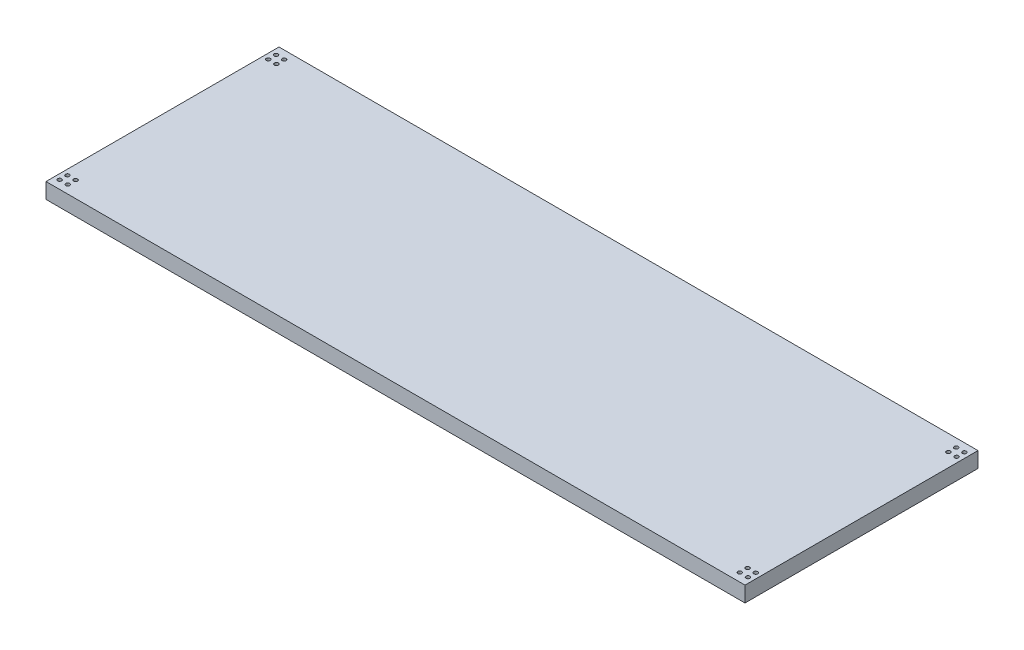
ISO-10303-21;
HEADER;
FILE_DESCRIPTION(('STEP AP214'),'2;1');
FILE_NAME('part.step','',(''),(''),'','','');
FILE_SCHEMA(('AUTOMOTIVE_DESIGN { 1 0 10303 214 1 1 1 1 }'));
ENDSEC;
DATA;
#1=APPLICATION_CONTEXT('core data for automotive mechanical design processes');
#2=APPLICATION_PROTOCOL_DEFINITION('international standard','automotive_design',2000,#1);
#3=PRODUCT_CONTEXT('',#1,'mechanical');
#4=PRODUCT('Part','Part','',(#3));
#5=PRODUCT_RELATED_PRODUCT_CATEGORY('part','',(#4));
#6=PRODUCT_DEFINITION_FORMATION('','',#4);
#7=PRODUCT_DEFINITION_CONTEXT('part definition',#1,'design');
#8=PRODUCT_DEFINITION('design','',#6,#7);
#9=PRODUCT_DEFINITION_SHAPE('','',#8);
#10=(LENGTH_UNIT() NAMED_UNIT(*) SI_UNIT(.MILLI.,.METRE.));
#11=(NAMED_UNIT(*) PLANE_ANGLE_UNIT() SI_UNIT($,.RADIAN.));
#12=(NAMED_UNIT(*) SI_UNIT($,.STERADIAN.) SOLID_ANGLE_UNIT());
#13=UNCERTAINTY_MEASURE_WITH_UNIT(LENGTH_MEASURE(1.E-05),#10,'distance_accuracy_value','');
#14=(GEOMETRIC_REPRESENTATION_CONTEXT(3) GLOBAL_UNCERTAINTY_ASSIGNED_CONTEXT((#13)) GLOBAL_UNIT_ASSIGNED_CONTEXT((#10,
#11,#12)) REPRESENTATION_CONTEXT('',''));
#15=CARTESIAN_POINT('',(0.,0.,0.));
#16=DIRECTION('',(0.,0.,1.));
#17=DIRECTION('',(1.,0.,0.));
#18=AXIS2_PLACEMENT_3D('',#15,#16,#17);
#19=CARTESIAN_POINT('',(0.,40.,0.));
#20=DIRECTION('',(0.,1.,0.));
#21=DIRECTION('',(0.,0.,1.));
#22=AXIS2_PLACEMENT_3D('',#19,#20,#21);
#23=PLANE('',#22);
#24=CARTESIAN_POINT('',(-865.244681743922,40.,-258.618032201995));
#25=DIRECTION('',(0.,1.,0.));
#26=DIRECTION('',(0.,0.,-1.));
#27=AXIS2_PLACEMENT_3D('',#24,#25,#26);
#28=CIRCLE('',#27,5.00000000000005);
#29=CARTESIAN_POINT('',(-865.244681743922,40.,-263.618032201995));
#30=VERTEX_POINT('',#29);
#31=EDGE_CURVE('E199',#30,#30,#28,.T.);
#32=ORIENTED_EDGE('',*,*,#31,.F.);
#33=EDGE_LOOP('',(#32));
#34=FACE_BOUND('',#33,.T.);
#35=CARTESIAN_POINT('',(-886.273197469976,40.,-278.618032201996));
#36=DIRECTION('',(0.,1.,0.));
#37=DIRECTION('',(0.,0.,-1.));
#38=AXIS2_PLACEMENT_3D('',#35,#36,#37);
#39=CIRCLE('',#38,5.00000000000005);
#40=CARTESIAN_POINT('',(-886.273197469976,40.,-283.618032201996));
#41=VERTEX_POINT('',#40);
#42=EDGE_CURVE('E187',#41,#41,#39,.T.);
#43=ORIENTED_EDGE('',*,*,#42,.F.);
#44=EDGE_LOOP('',(#43));
#45=FACE_BOUND('',#44,.T.);
#46=CARTESIAN_POINT('',(886.273197469975,40.,-258.618032201996));
#47=DIRECTION('',(0.,1.,0.));
#48=DIRECTION('',(0.,0.,1.));
#49=AXIS2_PLACEMENT_3D('',#46,#47,#48);
#50=CIRCLE('',#49,5.00000000000005);
#51=CARTESIAN_POINT('',(886.273197469975,40.,-253.618032201995));
#52=VERTEX_POINT('',#51);
#53=EDGE_CURVE('E175',#52,#52,#50,.T.);
#54=ORIENTED_EDGE('',*,*,#53,.F.);
#55=EDGE_LOOP('',(#54));
#56=FACE_BOUND('',#55,.T.);
#57=CARTESIAN_POINT('',(865.244681743922,40.,-278.618032201995));
#58=DIRECTION('',(0.,1.,0.));
#59=DIRECTION('',(0.,0.,1.));
#60=AXIS2_PLACEMENT_3D('',#57,#58,#59);
#61=CIRCLE('',#60,5.00000000000005);
#62=CARTESIAN_POINT('',(865.244681743922,40.,-273.618032201995));
#63=VERTEX_POINT('',#62);
#64=EDGE_CURVE('E163',#63,#63,#61,.T.);
#65=ORIENTED_EDGE('',*,*,#64,.F.);
#66=EDGE_LOOP('',(#65));
#67=FACE_BOUND('',#66,.T.);
#68=CARTESIAN_POINT('',(865.244681743922,40.,258.618032201995));
#69=DIRECTION('',(0.,1.,0.));
#70=DIRECTION('',(0.,0.,-1.));
#71=AXIS2_PLACEMENT_3D('',#68,#69,#70);
#72=CIRCLE('',#71,5.00000000000005);
#73=CARTESIAN_POINT('',(865.244681743922,40.,253.618032201995));
#74=VERTEX_POINT('',#73);
#75=EDGE_CURVE('E151',#74,#74,#72,.T.);
#76=ORIENTED_EDGE('',*,*,#75,.F.);
#77=EDGE_LOOP('',(#76));
#78=FACE_BOUND('',#77,.T.);
#79=CARTESIAN_POINT('',(886.273197469975,40.,278.618032201995));
#80=DIRECTION('',(0.,1.,0.));
#81=DIRECTION('',(0.,0.,-1.));
#82=AXIS2_PLACEMENT_3D('',#79,#80,#81);
#83=CIRCLE('',#82,5.00000000000005);
#84=CARTESIAN_POINT('',(886.273197469975,40.,273.618032201995));
#85=VERTEX_POINT('',#84);
#86=EDGE_CURVE('E139',#85,#85,#83,.T.);
#87=ORIENTED_EDGE('',*,*,#86,.F.);
#88=EDGE_LOOP('',(#87));
#89=FACE_BOUND('',#88,.T.);
#90=CARTESIAN_POINT('',(-865.244681743922,40.,258.618032201995));
#91=DIRECTION('',(0.,1.,0.));
#92=DIRECTION('',(0.,0.,1.));
#93=AXIS2_PLACEMENT_3D('',#90,#91,#92);
#94=CIRCLE('',#93,5.00000000000005);
#95=CARTESIAN_POINT('',(-865.244681743922,40.,263.618032201995));
#96=VERTEX_POINT('',#95);
#97=EDGE_CURVE('E127',#96,#96,#94,.T.);
#98=ORIENTED_EDGE('',*,*,#97,.F.);
#99=EDGE_LOOP('',(#98));
#100=FACE_BOUND('',#99,.T.);
#101=CARTESIAN_POINT('',(-886.273197469976,40.,278.618032201995));
#102=DIRECTION('',(0.,1.,0.));
#103=DIRECTION('',(0.,0.,1.));
#104=AXIS2_PLACEMENT_3D('',#101,#102,#103);
#105=CIRCLE('',#104,5.00000000000005);
#106=CARTESIAN_POINT('',(-886.273197469976,40.,283.618032201996));
#107=VERTEX_POINT('',#106);
#108=EDGE_CURVE('E106',#107,#107,#105,.T.);
#109=ORIENTED_EDGE('',*,*,#108,.F.);
#110=EDGE_LOOP('',(#109));
#111=FACE_BOUND('',#110,.T.);
#112=DIRECTION('',(0.,0.,-1.));
#113=VECTOR('',#112,1.);
#114=CARTESIAN_POINT('',(900.,40.,-300.));
#115=LINE('',#114,#113);
#116=CARTESIAN_POINT('',(900.,40.,300.));
#117=VERTEX_POINT('',#116);
#118=CARTESIAN_POINT('',(900.,40.,-300.));
#119=VERTEX_POINT('',#118);
#120=EDGE_CURVE('E91',#117,#119,#115,.T.);
#121=ORIENTED_EDGE('',*,*,#120,.T.);
#122=DIRECTION('',(-1.,0.,0.));
#123=VECTOR('',#122,1.);
#124=CARTESIAN_POINT('',(-900.,40.,-300.));
#125=LINE('',#124,#123);
#126=CARTESIAN_POINT('',(-900.,40.,-300.));
#127=VERTEX_POINT('',#126);
#128=EDGE_CURVE('E86',#119,#127,#125,.T.);
#129=ORIENTED_EDGE('',*,*,#128,.T.);
#130=DIRECTION('',(0.,0.,1.));
#131=VECTOR('',#130,1.);
#132=CARTESIAN_POINT('',(-900.,40.,-300.));
#133=LINE('',#132,#131);
#134=CARTESIAN_POINT('',(-900.,40.,300.));
#135=VERTEX_POINT('',#134);
#136=EDGE_CURVE('E89',#127,#135,#133,.T.);
#137=ORIENTED_EDGE('',*,*,#136,.T.);
#138=DIRECTION('',(1.,0.,0.));
#139=VECTOR('',#138,1.);
#140=CARTESIAN_POINT('',(-900.,40.,300.));
#141=LINE('',#140,#139);
#142=EDGE_CURVE('E56',#135,#117,#141,.T.);
#143=ORIENTED_EDGE('',*,*,#142,.T.);
#144=EDGE_LOOP('',(#121,#129,#137,#143));
#145=FACE_BOUND('',#144,.T.);
#146=CARTESIAN_POINT('',(-865.244681743922,40.,278.618032201995));
#147=DIRECTION('',(0.,1.,0.));
#148=DIRECTION('',(0.,0.,1.));
#149=AXIS2_PLACEMENT_3D('',#146,#147,#148);
#150=CIRCLE('',#149,5.00000000000005);
#151=CARTESIAN_POINT('',(-865.244681743922,40.,283.618032201995));
#152=VERTEX_POINT('',#151);
#153=EDGE_CURVE('E121',#152,#152,#150,.T.);
#154=ORIENTED_EDGE('',*,*,#153,.F.);
#155=EDGE_LOOP('',(#154));
#156=FACE_BOUND('',#155,.T.);
#157=CARTESIAN_POINT('',(-886.273197469976,40.,258.618032201995));
#158=DIRECTION('',(0.,1.,0.));
#159=DIRECTION('',(0.,0.,1.));
#160=AXIS2_PLACEMENT_3D('',#157,#158,#159);
#161=CIRCLE('',#160,5.00000000000005);
#162=CARTESIAN_POINT('',(-886.273197469976,40.,263.618032201996));
#163=VERTEX_POINT('',#162);
#164=EDGE_CURVE('E133',#163,#163,#161,.T.);
#165=ORIENTED_EDGE('',*,*,#164,.F.);
#166=EDGE_LOOP('',(#165));
#167=FACE_BOUND('',#166,.T.);
#168=CARTESIAN_POINT('',(886.273197469975,40.,258.618032201995));
#169=DIRECTION('',(0.,1.,0.));
#170=DIRECTION('',(0.,0.,-1.));
#171=AXIS2_PLACEMENT_3D('',#168,#169,#170);
#172=CIRCLE('',#171,5.00000000000005);
#173=CARTESIAN_POINT('',(886.273197469975,40.,253.618032201995));
#174=VERTEX_POINT('',#173);
#175=EDGE_CURVE('E145',#174,#174,#172,.T.);
#176=ORIENTED_EDGE('',*,*,#175,.F.);
#177=EDGE_LOOP('',(#176));
#178=FACE_BOUND('',#177,.T.);
#179=CARTESIAN_POINT('',(865.244681743922,40.,278.618032201995));
#180=DIRECTION('',(0.,1.,0.));
#181=DIRECTION('',(0.,0.,-1.));
#182=AXIS2_PLACEMENT_3D('',#179,#180,#181);
#183=CIRCLE('',#182,5.00000000000005);
#184=CARTESIAN_POINT('',(865.244681743922,40.,273.618032201995));
#185=VERTEX_POINT('',#184);
#186=EDGE_CURVE('E157',#185,#185,#183,.T.);
#187=ORIENTED_EDGE('',*,*,#186,.F.);
#188=EDGE_LOOP('',(#187));
#189=FACE_BOUND('',#188,.T.);
#190=CARTESIAN_POINT('',(886.273197469975,40.,-278.618032201996));
#191=DIRECTION('',(0.,1.,0.));
#192=DIRECTION('',(0.,0.,1.));
#193=AXIS2_PLACEMENT_3D('',#190,#191,#192);
#194=CIRCLE('',#193,5.00000000000005);
#195=CARTESIAN_POINT('',(886.273197469975,40.,-273.618032201996));
#196=VERTEX_POINT('',#195);
#197=EDGE_CURVE('E169',#196,#196,#194,.T.);
#198=ORIENTED_EDGE('',*,*,#197,.F.);
#199=EDGE_LOOP('',(#198));
#200=FACE_BOUND('',#199,.T.);
#201=CARTESIAN_POINT('',(865.244681743922,40.,-258.618032201995));
#202=DIRECTION('',(0.,1.,0.));
#203=DIRECTION('',(0.,0.,1.));
#204=AXIS2_PLACEMENT_3D('',#201,#202,#203);
#205=CIRCLE('',#204,5.00000000000005);
#206=CARTESIAN_POINT('',(865.244681743922,40.,-253.618032201995));
#207=VERTEX_POINT('',#206);
#208=EDGE_CURVE('E181',#207,#207,#205,.T.);
#209=ORIENTED_EDGE('',*,*,#208,.F.);
#210=EDGE_LOOP('',(#209));
#211=FACE_BOUND('',#210,.T.);
#212=CARTESIAN_POINT('',(-865.244681743922,40.,-278.618032201995));
#213=DIRECTION('',(0.,1.,0.));
#214=DIRECTION('',(0.,0.,-1.));
#215=AXIS2_PLACEMENT_3D('',#212,#213,#214);
#216=CIRCLE('',#215,5.00000000000005);
#217=CARTESIAN_POINT('',(-865.244681743922,40.,-283.618032201995));
#218=VERTEX_POINT('',#217);
#219=EDGE_CURVE('E193',#218,#218,#216,.T.);
#220=ORIENTED_EDGE('',*,*,#219,.F.);
#221=EDGE_LOOP('',(#220));
#222=FACE_BOUND('',#221,.T.);
#223=CARTESIAN_POINT('',(-886.273197469976,40.,-258.618032201996));
#224=DIRECTION('',(0.,1.,0.));
#225=DIRECTION('',(0.,0.,-1.));
#226=AXIS2_PLACEMENT_3D('',#223,#224,#225);
#227=CIRCLE('',#226,5.00000000000005);
#228=CARTESIAN_POINT('',(-886.273197469976,40.,-263.618032201996));
#229=VERTEX_POINT('',#228);
#230=EDGE_CURVE('E205',#229,#229,#227,.T.);
#231=ORIENTED_EDGE('',*,*,#230,.F.);
#232=EDGE_LOOP('',(#231));
#233=FACE_BOUND('',#232,.T.);
#234=ADVANCED_FACE('F39',(#34,#45,#56,#67,#78,#89,#100,#111,#145,#156,#167,#178,#189,#200,#211,
#222,#233),#23,.T.);
#235=CARTESIAN_POINT('',(0.,0.,0.));
#236=DIRECTION('',(0.,1.,0.));
#237=DIRECTION('',(0.,0.,1.));
#238=AXIS2_PLACEMENT_3D('',#235,#236,#237);
#239=PLANE('',#238);
#240=DIRECTION('',(0.,0.,-1.));
#241=VECTOR('',#240,1.);
#242=CARTESIAN_POINT('',(900.,0.,-300.));
#243=LINE('',#242,#241);
#244=CARTESIAN_POINT('',(900.,0.,300.));
#245=VERTEX_POINT('',#244);
#246=CARTESIAN_POINT('',(900.,0.,-300.));
#247=VERTEX_POINT('',#246);
#248=EDGE_CURVE('E103',#245,#247,#243,.T.);
#249=ORIENTED_EDGE('',*,*,#248,.F.);
#250=DIRECTION('',(1.,0.,0.));
#251=VECTOR('',#250,1.);
#252=CARTESIAN_POINT('',(-900.,0.,300.));
#253=LINE('',#252,#251);
#254=CARTESIAN_POINT('',(-900.,0.,300.));
#255=VERTEX_POINT('',#254);
#256=EDGE_CURVE('E79',#255,#245,#253,.T.);
#257=ORIENTED_EDGE('',*,*,#256,.F.);
#258=DIRECTION('',(0.,0.,1.));
#259=VECTOR('',#258,1.);
#260=CARTESIAN_POINT('',(-900.,0.,-300.));
#261=LINE('',#260,#259);
#262=CARTESIAN_POINT('',(-900.,0.,-300.));
#263=VERTEX_POINT('',#262);
#264=EDGE_CURVE('E73',#263,#255,#261,.T.);
#265=ORIENTED_EDGE('',*,*,#264,.F.);
#266=DIRECTION('',(-1.,0.,0.));
#267=VECTOR('',#266,1.);
#268=CARTESIAN_POINT('',(-900.,0.,-300.));
#269=LINE('',#268,#267);
#270=EDGE_CURVE('E95',#247,#263,#269,.T.);
#271=ORIENTED_EDGE('',*,*,#270,.F.);
#272=EDGE_LOOP('',(#249,#257,#265,#271));
#273=FACE_BOUND('',#272,.T.);
#274=CARTESIAN_POINT('',(-886.273197469976,0.,278.618032201995));
#275=DIRECTION('',(0.,1.,0.));
#276=DIRECTION('',(0.,0.,1.));
#277=AXIS2_PLACEMENT_3D('',#274,#275,#276);
#278=CIRCLE('',#277,5.00000000000005);
#279=CARTESIAN_POINT('',(-886.273197469976,0.,283.618032201996));
#280=VERTEX_POINT('',#279);
#281=EDGE_CURVE('E118',#280,#280,#278,.T.);
#282=ORIENTED_EDGE('',*,*,#281,.T.);
#283=EDGE_LOOP('',(#282));
#284=FACE_BOUND('',#283,.T.);
#285=CARTESIAN_POINT('',(-865.244681743922,0.,278.618032201995));
#286=DIRECTION('',(0.,1.,0.));
#287=DIRECTION('',(0.,0.,1.));
#288=AXIS2_PLACEMENT_3D('',#285,#286,#287);
#289=CIRCLE('',#288,5.00000000000005);
#290=CARTESIAN_POINT('',(-865.244681743922,0.,283.618032201995));
#291=VERTEX_POINT('',#290);
#292=EDGE_CURVE('E124',#291,#291,#289,.T.);
#293=ORIENTED_EDGE('',*,*,#292,.T.);
#294=EDGE_LOOP('',(#293));
#295=FACE_BOUND('',#294,.T.);
#296=CARTESIAN_POINT('',(-865.244681743922,0.,258.618032201995));
#297=DIRECTION('',(0.,1.,0.));
#298=DIRECTION('',(0.,0.,1.));
#299=AXIS2_PLACEMENT_3D('',#296,#297,#298);
#300=CIRCLE('',#299,5.00000000000005);
#301=CARTESIAN_POINT('',(-865.244681743922,0.,263.618032201995));
#302=VERTEX_POINT('',#301);
#303=EDGE_CURVE('E130',#302,#302,#300,.T.);
#304=ORIENTED_EDGE('',*,*,#303,.T.);
#305=EDGE_LOOP('',(#304));
#306=FACE_BOUND('',#305,.T.);
#307=CARTESIAN_POINT('',(-886.273197469976,0.,258.618032201995));
#308=DIRECTION('',(0.,1.,0.));
#309=DIRECTION('',(0.,0.,1.));
#310=AXIS2_PLACEMENT_3D('',#307,#308,#309);
#311=CIRCLE('',#310,5.00000000000005);
#312=CARTESIAN_POINT('',(-886.273197469976,0.,263.618032201996));
#313=VERTEX_POINT('',#312);
#314=EDGE_CURVE('E136',#313,#313,#311,.T.);
#315=ORIENTED_EDGE('',*,*,#314,.T.);
#316=EDGE_LOOP('',(#315));
#317=FACE_BOUND('',#316,.T.);
#318=CARTESIAN_POINT('',(886.273197469975,0.,278.618032201995));
#319=DIRECTION('',(0.,1.,0.));
#320=DIRECTION('',(0.,0.,-1.));
#321=AXIS2_PLACEMENT_3D('',#318,#319,#320);
#322=CIRCLE('',#321,5.00000000000005);
#323=CARTESIAN_POINT('',(886.273197469975,0.,273.618032201995));
#324=VERTEX_POINT('',#323);
#325=EDGE_CURVE('E142',#324,#324,#322,.T.);
#326=ORIENTED_EDGE('',*,*,#325,.T.);
#327=EDGE_LOOP('',(#326));
#328=FACE_BOUND('',#327,.T.);
#329=CARTESIAN_POINT('',(886.273197469975,0.,258.618032201995));
#330=DIRECTION('',(0.,1.,0.));
#331=DIRECTION('',(0.,0.,-1.));
#332=AXIS2_PLACEMENT_3D('',#329,#330,#331);
#333=CIRCLE('',#332,5.00000000000005);
#334=CARTESIAN_POINT('',(886.273197469975,0.,253.618032201995));
#335=VERTEX_POINT('',#334);
#336=EDGE_CURVE('E148',#335,#335,#333,.T.);
#337=ORIENTED_EDGE('',*,*,#336,.T.);
#338=EDGE_LOOP('',(#337));
#339=FACE_BOUND('',#338,.T.);
#340=CARTESIAN_POINT('',(865.244681743922,0.,258.618032201995));
#341=DIRECTION('',(0.,1.,0.));
#342=DIRECTION('',(0.,0.,-1.));
#343=AXIS2_PLACEMENT_3D('',#340,#341,#342);
#344=CIRCLE('',#343,5.00000000000005);
#345=CARTESIAN_POINT('',(865.244681743922,0.,253.618032201995));
#346=VERTEX_POINT('',#345);
#347=EDGE_CURVE('E154',#346,#346,#344,.T.);
#348=ORIENTED_EDGE('',*,*,#347,.T.);
#349=EDGE_LOOP('',(#348));
#350=FACE_BOUND('',#349,.T.);
#351=CARTESIAN_POINT('',(865.244681743922,0.,278.618032201995));
#352=DIRECTION('',(0.,1.,0.));
#353=DIRECTION('',(0.,0.,-1.));
#354=AXIS2_PLACEMENT_3D('',#351,#352,#353);
#355=CIRCLE('',#354,5.00000000000005);
#356=CARTESIAN_POINT('',(865.244681743922,0.,273.618032201995));
#357=VERTEX_POINT('',#356);
#358=EDGE_CURVE('E160',#357,#357,#355,.T.);
#359=ORIENTED_EDGE('',*,*,#358,.T.);
#360=EDGE_LOOP('',(#359));
#361=FACE_BOUND('',#360,.T.);
#362=CARTESIAN_POINT('',(865.244681743922,0.,-278.618032201995));
#363=DIRECTION('',(0.,1.,0.));
#364=DIRECTION('',(0.,0.,1.));
#365=AXIS2_PLACEMENT_3D('',#362,#363,#364);
#366=CIRCLE('',#365,5.00000000000005);
#367=CARTESIAN_POINT('',(865.244681743922,0.,-273.618032201995));
#368=VERTEX_POINT('',#367);
#369=EDGE_CURVE('E166',#368,#368,#366,.T.);
#370=ORIENTED_EDGE('',*,*,#369,.T.);
#371=EDGE_LOOP('',(#370));
#372=FACE_BOUND('',#371,.T.);
#373=CARTESIAN_POINT('',(886.273197469975,0.,-278.618032201996));
#374=DIRECTION('',(0.,1.,0.));
#375=DIRECTION('',(0.,0.,1.));
#376=AXIS2_PLACEMENT_3D('',#373,#374,#375);
#377=CIRCLE('',#376,5.00000000000005);
#378=CARTESIAN_POINT('',(886.273197469975,0.,-273.618032201996));
#379=VERTEX_POINT('',#378);
#380=EDGE_CURVE('E172',#379,#379,#377,.T.);
#381=ORIENTED_EDGE('',*,*,#380,.T.);
#382=EDGE_LOOP('',(#381));
#383=FACE_BOUND('',#382,.T.);
#384=CARTESIAN_POINT('',(886.273197469975,0.,-258.618032201996));
#385=DIRECTION('',(0.,1.,0.));
#386=DIRECTION('',(0.,0.,1.));
#387=AXIS2_PLACEMENT_3D('',#384,#385,#386);
#388=CIRCLE('',#387,5.00000000000005);
#389=CARTESIAN_POINT('',(886.273197469975,0.,-253.618032201995));
#390=VERTEX_POINT('',#389);
#391=EDGE_CURVE('E178',#390,#390,#388,.T.);
#392=ORIENTED_EDGE('',*,*,#391,.T.);
#393=EDGE_LOOP('',(#392));
#394=FACE_BOUND('',#393,.T.);
#395=CARTESIAN_POINT('',(865.244681743922,0.,-258.618032201995));
#396=DIRECTION('',(0.,1.,0.));
#397=DIRECTION('',(0.,0.,1.));
#398=AXIS2_PLACEMENT_3D('',#395,#396,#397);
#399=CIRCLE('',#398,5.00000000000005);
#400=CARTESIAN_POINT('',(865.244681743922,0.,-253.618032201995));
#401=VERTEX_POINT('',#400);
#402=EDGE_CURVE('E184',#401,#401,#399,.T.);
#403=ORIENTED_EDGE('',*,*,#402,.T.);
#404=EDGE_LOOP('',(#403));
#405=FACE_BOUND('',#404,.T.);
#406=CARTESIAN_POINT('',(-886.273197469976,0.,-278.618032201996));
#407=DIRECTION('',(0.,1.,0.));
#408=DIRECTION('',(0.,0.,-1.));
#409=AXIS2_PLACEMENT_3D('',#406,#407,#408);
#410=CIRCLE('',#409,5.00000000000005);
#411=CARTESIAN_POINT('',(-886.273197469976,0.,-283.618032201996));
#412=VERTEX_POINT('',#411);
#413=EDGE_CURVE('E190',#412,#412,#410,.T.);
#414=ORIENTED_EDGE('',*,*,#413,.T.);
#415=EDGE_LOOP('',(#414));
#416=FACE_BOUND('',#415,.T.);
#417=CARTESIAN_POINT('',(-865.244681743922,0.,-278.618032201995));
#418=DIRECTION('',(0.,1.,0.));
#419=DIRECTION('',(0.,0.,-1.));
#420=AXIS2_PLACEMENT_3D('',#417,#418,#419);
#421=CIRCLE('',#420,5.00000000000005);
#422=CARTESIAN_POINT('',(-865.244681743922,0.,-283.618032201995));
#423=VERTEX_POINT('',#422);
#424=EDGE_CURVE('E196',#423,#423,#421,.T.);
#425=ORIENTED_EDGE('',*,*,#424,.T.);
#426=EDGE_LOOP('',(#425));
#427=FACE_BOUND('',#426,.T.);
#428=CARTESIAN_POINT('',(-865.244681743922,0.,-258.618032201995));
#429=DIRECTION('',(0.,1.,0.));
#430=DIRECTION('',(0.,0.,-1.));
#431=AXIS2_PLACEMENT_3D('',#428,#429,#430);
#432=CIRCLE('',#431,5.00000000000005);
#433=CARTESIAN_POINT('',(-865.244681743922,0.,-263.618032201995));
#434=VERTEX_POINT('',#433);
#435=EDGE_CURVE('E202',#434,#434,#432,.T.);
#436=ORIENTED_EDGE('',*,*,#435,.T.);
#437=EDGE_LOOP('',(#436));
#438=FACE_BOUND('',#437,.T.);
#439=CARTESIAN_POINT('',(-886.273197469976,0.,-258.618032201996));
#440=DIRECTION('',(0.,1.,0.));
#441=DIRECTION('',(0.,0.,-1.));
#442=AXIS2_PLACEMENT_3D('',#439,#440,#441);
#443=CIRCLE('',#442,5.00000000000005);
#444=CARTESIAN_POINT('',(-886.273197469976,0.,-263.618032201996));
#445=VERTEX_POINT('',#444);
#446=EDGE_CURVE('E208',#445,#445,#443,.T.);
#447=ORIENTED_EDGE('',*,*,#446,.T.);
#448=EDGE_LOOP('',(#447));
#449=FACE_BOUND('',#448,.T.);
#450=ADVANCED_FACE('F114',(#273,#284,#295,#306,#317,#328,#339,#350,#361,#372,#383,#394,#405,
#416,#427,#438,#449),#239,.F.);
#451=CARTESIAN_POINT('',(900.,40.,-300.));
#452=DIRECTION('',(-1.,0.,0.));
#453=DIRECTION('',(0.,0.,1.));
#454=AXIS2_PLACEMENT_3D('',#451,#452,#453);
#455=PLANE('',#454);
#456=ORIENTED_EDGE('',*,*,#248,.T.);
#457=DIRECTION('',(0.,-1.,0.));
#458=VECTOR('',#457,1.);
#459=CARTESIAN_POINT('',(900.,40.,-300.));
#460=LINE('',#459,#458);
#461=EDGE_CURVE('E11',#119,#247,#460,.T.);
#462=ORIENTED_EDGE('',*,*,#461,.F.);
#463=ORIENTED_EDGE('',*,*,#120,.F.);
#464=DIRECTION('',(0.,-1.,0.));
#465=VECTOR('',#464,1.);
#466=CARTESIAN_POINT('',(900.,40.,300.));
#467=LINE('',#466,#465);
#468=EDGE_CURVE('E99',#117,#245,#467,.T.);
#469=ORIENTED_EDGE('',*,*,#468,.T.);
#470=EDGE_LOOP('',(#456,#462,#463,#469));
#471=FACE_BOUND('',#470,.T.);
#472=ADVANCED_FACE('F41',(#471),#455,.F.);
#473=CARTESIAN_POINT('',(-900.,40.,-300.));
#474=DIRECTION('',(0.,0.,1.));
#475=DIRECTION('',(1.,0.,0.));
#476=AXIS2_PLACEMENT_3D('',#473,#474,#475);
#477=PLANE('',#476);
#478=ORIENTED_EDGE('',*,*,#270,.T.);
#479=DIRECTION('',(0.,-1.,0.));
#480=VECTOR('',#479,1.);
#481=CARTESIAN_POINT('',(-900.,40.,-300.));
#482=LINE('',#481,#480);
#483=EDGE_CURVE('E48',#127,#263,#482,.T.);
#484=ORIENTED_EDGE('',*,*,#483,.F.);
#485=ORIENTED_EDGE('',*,*,#128,.F.);
#486=ORIENTED_EDGE('',*,*,#461,.T.);
#487=EDGE_LOOP('',(#478,#484,#485,#486));
#488=FACE_BOUND('',#487,.T.);
#489=ADVANCED_FACE('F94',(#488),#477,.F.);
#490=CARTESIAN_POINT('',(-900.,40.,-300.));
#491=DIRECTION('',(1.,0.,0.));
#492=DIRECTION('',(0.,0.,-1.));
#493=AXIS2_PLACEMENT_3D('',#490,#491,#492);
#494=PLANE('',#493);
#495=ORIENTED_EDGE('',*,*,#264,.T.);
#496=DIRECTION('',(0.,-1.,0.));
#497=VECTOR('',#496,1.);
#498=CARTESIAN_POINT('',(-900.,40.,300.));
#499=LINE('',#498,#497);
#500=EDGE_CURVE('E96',#135,#255,#499,.T.);
#501=ORIENTED_EDGE('',*,*,#500,.F.);
#502=ORIENTED_EDGE('',*,*,#136,.F.);
#503=ORIENTED_EDGE('',*,*,#483,.T.);
#504=EDGE_LOOP('',(#495,#501,#502,#503));
#505=FACE_BOUND('',#504,.T.);
#506=ADVANCED_FACE('F97',(#505),#494,.F.);
#507=CARTESIAN_POINT('',(-900.,40.,300.));
#508=DIRECTION('',(0.,0.,-1.));
#509=DIRECTION('',(-1.,0.,0.));
#510=AXIS2_PLACEMENT_3D('',#507,#508,#509);
#511=PLANE('',#510);
#512=ORIENTED_EDGE('',*,*,#256,.T.);
#513=ORIENTED_EDGE('',*,*,#468,.F.);
#514=ORIENTED_EDGE('',*,*,#142,.F.);
#515=ORIENTED_EDGE('',*,*,#500,.T.);
#516=EDGE_LOOP('',(#512,#513,#514,#515));
#517=FACE_BOUND('',#516,.T.);
#518=ADVANCED_FACE('F111',(#517),#511,.F.);
#519=CARTESIAN_POINT('',(-886.273197469976,40.,278.618032201995));
#520=DIRECTION('',(0.,-1.,0.));
#521=DIRECTION('',(0.,0.,-1.));
#522=AXIS2_PLACEMENT_3D('',#519,#520,#521);
#523=CYLINDRICAL_SURFACE('',#522,5.00000000000005);
#524=ORIENTED_EDGE('',*,*,#108,.T.);
#525=EDGE_LOOP('',(#524));
#526=FACE_BOUND('',#525,.T.);
#527=ORIENTED_EDGE('',*,*,#281,.F.);
#528=EDGE_LOOP('',(#527));
#529=FACE_BOUND('',#528,.T.);
#530=ADVANCED_FACE('F227',(#526,#529),#523,.F.);
#531=CARTESIAN_POINT('',(-865.244681743922,40.,278.618032201995));
#532=DIRECTION('',(0.,-1.,0.));
#533=DIRECTION('',(0.,0.,-1.));
#534=AXIS2_PLACEMENT_3D('',#531,#532,#533);
#535=CYLINDRICAL_SURFACE('',#534,5.00000000000005);
#536=ORIENTED_EDGE('',*,*,#153,.T.);
#537=EDGE_LOOP('',(#536));
#538=FACE_BOUND('',#537,.T.);
#539=ORIENTED_EDGE('',*,*,#292,.F.);
#540=EDGE_LOOP('',(#539));
#541=FACE_BOUND('',#540,.T.);
#542=ADVANCED_FACE('F272',(#538,#541),#535,.F.);
#543=CARTESIAN_POINT('',(-865.244681743922,40.,258.618032201995));
#544=DIRECTION('',(0.,-1.,0.));
#545=DIRECTION('',(0.,0.,-1.));
#546=AXIS2_PLACEMENT_3D('',#543,#544,#545);
#547=CYLINDRICAL_SURFACE('',#546,5.00000000000005);
#548=ORIENTED_EDGE('',*,*,#97,.T.);
#549=EDGE_LOOP('',(#548));
#550=FACE_BOUND('',#549,.T.);
#551=ORIENTED_EDGE('',*,*,#303,.F.);
#552=EDGE_LOOP('',(#551));
#553=FACE_BOUND('',#552,.T.);
#554=ADVANCED_FACE('F280',(#550,#553),#547,.F.);
#555=CARTESIAN_POINT('',(-886.273197469976,40.,258.618032201995));
#556=DIRECTION('',(0.,-1.,0.));
#557=DIRECTION('',(0.,0.,-1.));
#558=AXIS2_PLACEMENT_3D('',#555,#556,#557);
#559=CYLINDRICAL_SURFACE('',#558,5.00000000000005);
#560=ORIENTED_EDGE('',*,*,#164,.T.);
#561=EDGE_LOOP('',(#560));
#562=FACE_BOUND('',#561,.T.);
#563=ORIENTED_EDGE('',*,*,#314,.F.);
#564=EDGE_LOOP('',(#563));
#565=FACE_BOUND('',#564,.T.);
#566=ADVANCED_FACE('F288',(#562,#565),#559,.F.);
#567=CARTESIAN_POINT('',(886.273197469975,40.,278.618032201995));
#568=DIRECTION('',(0.,-1.,0.));
#569=DIRECTION('',(0.,0.,-1.));
#570=AXIS2_PLACEMENT_3D('',#567,#568,#569);
#571=CYLINDRICAL_SURFACE('',#570,5.00000000000005);
#572=ORIENTED_EDGE('',*,*,#86,.T.);
#573=EDGE_LOOP('',(#572));
#574=FACE_BOUND('',#573,.T.);
#575=ORIENTED_EDGE('',*,*,#325,.F.);
#576=EDGE_LOOP('',(#575));
#577=FACE_BOUND('',#576,.T.);
#578=ADVANCED_FACE('F297',(#574,#577),#571,.F.);
#579=CARTESIAN_POINT('',(886.273197469975,40.,258.618032201995));
#580=DIRECTION('',(0.,-1.,0.));
#581=DIRECTION('',(0.,0.,-1.));
#582=AXIS2_PLACEMENT_3D('',#579,#580,#581);
#583=CYLINDRICAL_SURFACE('',#582,5.00000000000005);
#584=ORIENTED_EDGE('',*,*,#175,.T.);
#585=EDGE_LOOP('',(#584));
#586=FACE_BOUND('',#585,.T.);
#587=ORIENTED_EDGE('',*,*,#336,.F.);
#588=EDGE_LOOP('',(#587));
#589=FACE_BOUND('',#588,.T.);
#590=ADVANCED_FACE('F306',(#586,#589),#583,.F.);
#591=CARTESIAN_POINT('',(865.244681743922,40.,258.618032201995));
#592=DIRECTION('',(0.,-1.,0.));
#593=DIRECTION('',(0.,0.,-1.));
#594=AXIS2_PLACEMENT_3D('',#591,#592,#593);
#595=CYLINDRICAL_SURFACE('',#594,5.00000000000005);
#596=ORIENTED_EDGE('',*,*,#75,.T.);
#597=EDGE_LOOP('',(#596));
#598=FACE_BOUND('',#597,.T.);
#599=ORIENTED_EDGE('',*,*,#347,.F.);
#600=EDGE_LOOP('',(#599));
#601=FACE_BOUND('',#600,.T.);
#602=ADVANCED_FACE('F315',(#598,#601),#595,.F.);
#603=CARTESIAN_POINT('',(865.244681743922,40.,278.618032201995));
#604=DIRECTION('',(0.,-1.,0.));
#605=DIRECTION('',(0.,0.,-1.));
#606=AXIS2_PLACEMENT_3D('',#603,#604,#605);
#607=CYLINDRICAL_SURFACE('',#606,5.00000000000005);
#608=ORIENTED_EDGE('',*,*,#186,.T.);
#609=EDGE_LOOP('',(#608));
#610=FACE_BOUND('',#609,.T.);
#611=ORIENTED_EDGE('',*,*,#358,.F.);
#612=EDGE_LOOP('',(#611));
#613=FACE_BOUND('',#612,.T.);
#614=ADVANCED_FACE('F324',(#610,#613),#607,.F.);
#615=CARTESIAN_POINT('',(865.244681743922,40.,-278.618032201995));
#616=DIRECTION('',(0.,-1.,0.));
#617=DIRECTION('',(0.,0.,-1.));
#618=AXIS2_PLACEMENT_3D('',#615,#616,#617);
#619=CYLINDRICAL_SURFACE('',#618,5.00000000000005);
#620=ORIENTED_EDGE('',*,*,#64,.T.);
#621=EDGE_LOOP('',(#620));
#622=FACE_BOUND('',#621,.T.);
#623=ORIENTED_EDGE('',*,*,#369,.F.);
#624=EDGE_LOOP('',(#623));
#625=FACE_BOUND('',#624,.T.);
#626=ADVANCED_FACE('F333',(#622,#625),#619,.F.);
#627=CARTESIAN_POINT('',(886.273197469975,40.,-278.618032201996));
#628=DIRECTION('',(0.,-1.,0.));
#629=DIRECTION('',(0.,0.,-1.));
#630=AXIS2_PLACEMENT_3D('',#627,#628,#629);
#631=CYLINDRICAL_SURFACE('',#630,5.00000000000005);
#632=ORIENTED_EDGE('',*,*,#197,.T.);
#633=EDGE_LOOP('',(#632));
#634=FACE_BOUND('',#633,.T.);
#635=ORIENTED_EDGE('',*,*,#380,.F.);
#636=EDGE_LOOP('',(#635));
#637=FACE_BOUND('',#636,.T.);
#638=ADVANCED_FACE('F342',(#634,#637),#631,.F.);
#639=CARTESIAN_POINT('',(886.273197469975,40.,-258.618032201996));
#640=DIRECTION('',(0.,-1.,0.));
#641=DIRECTION('',(0.,0.,-1.));
#642=AXIS2_PLACEMENT_3D('',#639,#640,#641);
#643=CYLINDRICAL_SURFACE('',#642,5.00000000000005);
#644=ORIENTED_EDGE('',*,*,#53,.T.);
#645=EDGE_LOOP('',(#644));
#646=FACE_BOUND('',#645,.T.);
#647=ORIENTED_EDGE('',*,*,#391,.F.);
#648=EDGE_LOOP('',(#647));
#649=FACE_BOUND('',#648,.T.);
#650=ADVANCED_FACE('F351',(#646,#649),#643,.F.);
#651=CARTESIAN_POINT('',(865.244681743922,40.,-258.618032201995));
#652=DIRECTION('',(0.,-1.,0.));
#653=DIRECTION('',(0.,0.,-1.));
#654=AXIS2_PLACEMENT_3D('',#651,#652,#653);
#655=CYLINDRICAL_SURFACE('',#654,5.00000000000005);
#656=ORIENTED_EDGE('',*,*,#208,.T.);
#657=EDGE_LOOP('',(#656));
#658=FACE_BOUND('',#657,.T.);
#659=ORIENTED_EDGE('',*,*,#402,.F.);
#660=EDGE_LOOP('',(#659));
#661=FACE_BOUND('',#660,.T.);
#662=ADVANCED_FACE('F360',(#658,#661),#655,.F.);
#663=CARTESIAN_POINT('',(-886.273197469976,40.,-278.618032201996));
#664=DIRECTION('',(0.,-1.,0.));
#665=DIRECTION('',(0.,0.,-1.));
#666=AXIS2_PLACEMENT_3D('',#663,#664,#665);
#667=CYLINDRICAL_SURFACE('',#666,5.00000000000005);
#668=ORIENTED_EDGE('',*,*,#42,.T.);
#669=EDGE_LOOP('',(#668));
#670=FACE_BOUND('',#669,.T.);
#671=ORIENTED_EDGE('',*,*,#413,.F.);
#672=EDGE_LOOP('',(#671));
#673=FACE_BOUND('',#672,.T.);
#674=ADVANCED_FACE('F369',(#670,#673),#667,.F.);
#675=CARTESIAN_POINT('',(-865.244681743922,40.,-278.618032201995));
#676=DIRECTION('',(0.,-1.,0.));
#677=DIRECTION('',(0.,0.,-1.));
#678=AXIS2_PLACEMENT_3D('',#675,#676,#677);
#679=CYLINDRICAL_SURFACE('',#678,5.00000000000005);
#680=ORIENTED_EDGE('',*,*,#219,.T.);
#681=EDGE_LOOP('',(#680));
#682=FACE_BOUND('',#681,.T.);
#683=ORIENTED_EDGE('',*,*,#424,.F.);
#684=EDGE_LOOP('',(#683));
#685=FACE_BOUND('',#684,.T.);
#686=ADVANCED_FACE('F378',(#682,#685),#679,.F.);
#687=CARTESIAN_POINT('',(-865.244681743922,40.,-258.618032201995));
#688=DIRECTION('',(0.,-1.,0.));
#689=DIRECTION('',(0.,0.,-1.));
#690=AXIS2_PLACEMENT_3D('',#687,#688,#689);
#691=CYLINDRICAL_SURFACE('',#690,5.00000000000005);
#692=ORIENTED_EDGE('',*,*,#31,.T.);
#693=EDGE_LOOP('',(#692));
#694=FACE_BOUND('',#693,.T.);
#695=ORIENTED_EDGE('',*,*,#435,.F.);
#696=EDGE_LOOP('',(#695));
#697=FACE_BOUND('',#696,.T.);
#698=ADVANCED_FACE('F387',(#694,#697),#691,.F.);
#699=CARTESIAN_POINT('',(-886.273197469976,40.,-258.618032201996));
#700=DIRECTION('',(0.,-1.,0.));
#701=DIRECTION('',(0.,0.,-1.));
#702=AXIS2_PLACEMENT_3D('',#699,#700,#701);
#703=CYLINDRICAL_SURFACE('',#702,5.00000000000005);
#704=ORIENTED_EDGE('',*,*,#230,.T.);
#705=EDGE_LOOP('',(#704));
#706=FACE_BOUND('',#705,.T.);
#707=ORIENTED_EDGE('',*,*,#446,.F.);
#708=EDGE_LOOP('',(#707));
#709=FACE_BOUND('',#708,.T.);
#710=ADVANCED_FACE('F214',(#706,#709),#703,.F.);
#711=CLOSED_SHELL('',(#234,#450,#472,#489,#506,#518,#530,#542,#554,#566,#578,#590,#602,#614,
#626,#638,#650,#662,#674,#686,#698,#710));
#712=MANIFOLD_SOLID_BREP('B2',#711);
#713=ADVANCED_BREP_SHAPE_REPRESENTATION('',(#18,#712),#14);
#714=SHAPE_DEFINITION_REPRESENTATION(#9,#713);
ENDSEC;
END-ISO-10303-21;
